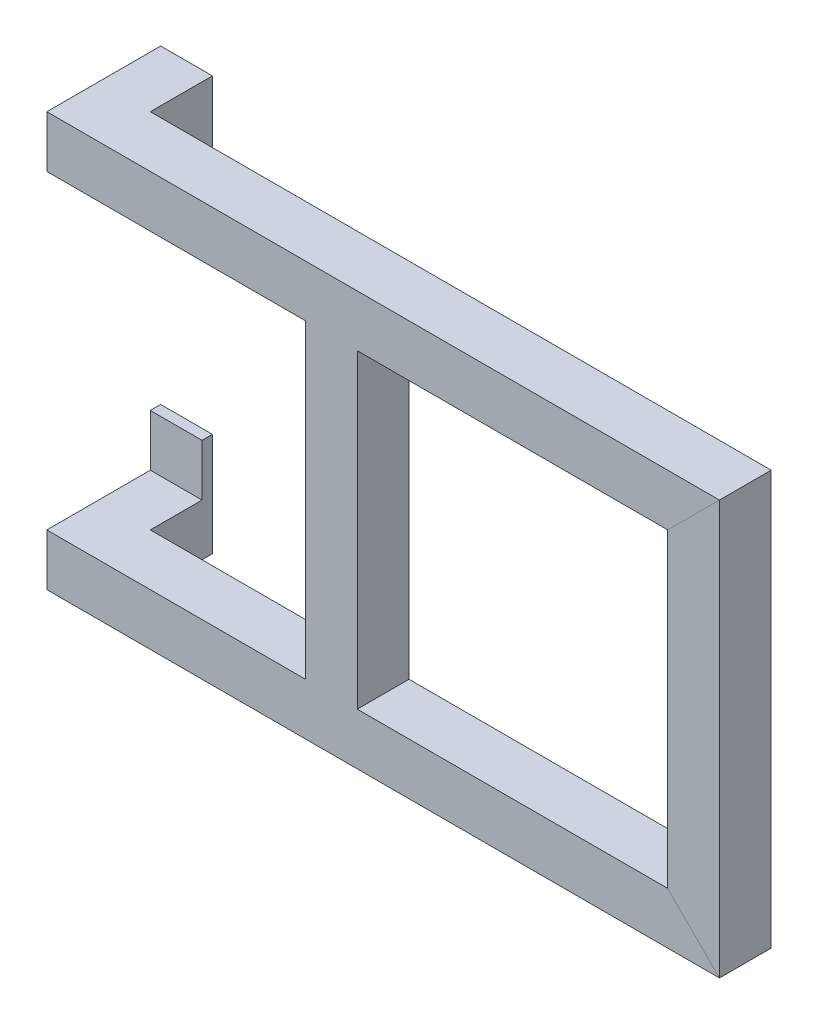
ISO-10303-21;
HEADER;
FILE_DESCRIPTION(('STEP AP214'),'2;1');
FILE_NAME('part.step','',(''),(''),'','','');
FILE_SCHEMA(('AUTOMOTIVE_DESIGN { 1 0 10303 214 1 1 1 1 }'));
ENDSEC;
DATA;
#1=APPLICATION_CONTEXT('core data for automotive mechanical design processes');
#2=APPLICATION_PROTOCOL_DEFINITION('international standard','automotive_design',2000,#1);
#3=PRODUCT_CONTEXT('',#1,'mechanical');
#4=PRODUCT('Part','Part','',(#3));
#5=PRODUCT_RELATED_PRODUCT_CATEGORY('part','',(#4));
#6=PRODUCT_DEFINITION_FORMATION('','',#4);
#7=PRODUCT_DEFINITION_CONTEXT('part definition',#1,'design');
#8=PRODUCT_DEFINITION('design','',#6,#7);
#9=PRODUCT_DEFINITION_SHAPE('','',#8);
#10=(LENGTH_UNIT() NAMED_UNIT(*) SI_UNIT(.MILLI.,.METRE.));
#11=(NAMED_UNIT(*) PLANE_ANGLE_UNIT() SI_UNIT($,.RADIAN.));
#12=(NAMED_UNIT(*) SI_UNIT($,.STERADIAN.) SOLID_ANGLE_UNIT());
#13=UNCERTAINTY_MEASURE_WITH_UNIT(LENGTH_MEASURE(1.E-05),#10,'distance_accuracy_value','');
#14=(GEOMETRIC_REPRESENTATION_CONTEXT(3) GLOBAL_UNCERTAINTY_ASSIGNED_CONTEXT((#13)) GLOBAL_UNIT_ASSIGNED_CONTEXT((#10,
#11,#12)) REPRESENTATION_CONTEXT('',''));
#15=CARTESIAN_POINT('',(0.,0.,0.));
#16=DIRECTION('',(0.,0.,1.));
#17=DIRECTION('',(1.,0.,0.));
#18=AXIS2_PLACEMENT_3D('',#15,#16,#17);
#19=CARTESIAN_POINT('',(325.,-150.,0.));
#20=DIRECTION('',(0.,1.,0.));
#21=DIRECTION('',(0.,0.,1.));
#22=AXIS2_PLACEMENT_3D('',#19,#20,#21);
#23=PLANE('',#22);
#24=DIRECTION('',(0.,0.,1.));
#25=VECTOR('',#24,1.);
#26=CARTESIAN_POINT('',(-275.,-150.,-110.));
#27=LINE('',#26,#25);
#28=CARTESIAN_POINT('',(-275.,-150.,-100.));
#29=VERTEX_POINT('',#28);
#30=CARTESIAN_POINT('',(-275.,-150.,-50.));
#31=VERTEX_POINT('',#30);
#32=EDGE_CURVE('E57',#29,#31,#27,.T.);
#33=ORIENTED_EDGE('',*,*,#32,.F.);
#34=DIRECTION('',(-1.,0.,0.));
#35=VECTOR('',#34,1.);
#36=CARTESIAN_POINT('',(325.,-150.,-100.));
#37=LINE('',#36,#35);
#38=CARTESIAN_POINT('',(-325.,-150.,-100.));
#39=VERTEX_POINT('',#38);
#40=EDGE_CURVE('E52',#29,#39,#37,.T.);
#41=ORIENTED_EDGE('',*,*,#40,.T.);
#42=DIRECTION('',(0.,0.,-1.));
#43=VECTOR('',#42,1.);
#44=CARTESIAN_POINT('',(-325.,-150.,0.));
#45=LINE('',#44,#43);
#46=CARTESIAN_POINT('',(-325.,-150.,0.));
#47=VERTEX_POINT('',#46);
#48=EDGE_CURVE('E179',#47,#39,#45,.T.);
#49=ORIENTED_EDGE('',*,*,#48,.F.);
#50=DIRECTION('',(-1.,0.,0.));
#51=VECTOR('',#50,1.);
#52=CARTESIAN_POINT('',(325.,-150.,0.));
#53=LINE('',#52,#51);
#54=CARTESIAN_POINT('',(-75.,-150.,0.));
#55=VERTEX_POINT('',#54);
#56=EDGE_CURVE('E325',#55,#47,#53,.T.);
#57=ORIENTED_EDGE('',*,*,#56,.F.);
#58=DIRECTION('',(0.,0.,1.));
#59=VECTOR('',#58,1.);
#60=CARTESIAN_POINT('',(-74.9999999999999,-150.,0.));
#61=LINE('',#60,#59);
#62=CARTESIAN_POINT('',(-74.9999999999999,-150.,-50.));
#63=VERTEX_POINT('',#62);
#64=EDGE_CURVE('E236',#63,#55,#61,.T.);
#65=ORIENTED_EDGE('',*,*,#64,.F.);
#66=DIRECTION('',(-1.,0.,0.));
#67=VECTOR('',#66,1.);
#68=CARTESIAN_POINT('',(325.,-150.,-50.));
#69=LINE('',#68,#67);
#70=EDGE_CURVE('E323',#63,#31,#69,.T.);
#71=ORIENTED_EDGE('',*,*,#70,.T.);
#72=EDGE_LOOP('',(#33,#41,#49,#57,#65,#71));
#73=FACE_BOUND('',#72,.T.);
#74=ADVANCED_FACE('F37',(#73),#23,.T.);
#75=CARTESIAN_POINT('',(-325.,150.,0.));
#76=DIRECTION('',(0.,-1.,0.));
#77=DIRECTION('',(0.,0.,-1.));
#78=AXIS2_PLACEMENT_3D('',#75,#76,#77);
#79=PLANE('',#78);
#80=DIRECTION('',(0.,0.,-1.));
#81=VECTOR('',#80,1.);
#82=CARTESIAN_POINT('',(-325.,150.,0.));
#83=LINE('',#82,#81);
#84=CARTESIAN_POINT('',(-325.,150.,0.));
#85=VERTEX_POINT('',#84);
#86=CARTESIAN_POINT('',(-325.,150.,-100.));
#87=VERTEX_POINT('',#86);
#88=EDGE_CURVE('E272',#85,#87,#83,.T.);
#89=ORIENTED_EDGE('',*,*,#88,.T.);
#90=DIRECTION('',(1.,0.,0.));
#91=VECTOR('',#90,1.);
#92=CARTESIAN_POINT('',(-325.,150.,-100.));
#93=LINE('',#92,#91);
#94=CARTESIAN_POINT('',(-275.,150.,-100.));
#95=VERTEX_POINT('',#94);
#96=EDGE_CURVE('E217',#87,#95,#93,.T.);
#97=ORIENTED_EDGE('',*,*,#96,.T.);
#98=DIRECTION('',(0.,0.,1.));
#99=VECTOR('',#98,1.);
#100=CARTESIAN_POINT('',(-275.,150.,-110.));
#101=LINE('',#100,#99);
#102=CARTESIAN_POINT('',(-275.,150.,-50.));
#103=VERTEX_POINT('',#102);
#104=EDGE_CURVE('E260',#95,#103,#101,.T.);
#105=ORIENTED_EDGE('',*,*,#104,.T.);
#106=DIRECTION('',(1.,0.,0.));
#107=VECTOR('',#106,1.);
#108=CARTESIAN_POINT('',(-325.,150.,-50.));
#109=LINE('',#108,#107);
#110=CARTESIAN_POINT('',(-75.,150.,-50.));
#111=VERTEX_POINT('',#110);
#112=EDGE_CURVE('E290',#103,#111,#109,.T.);
#113=ORIENTED_EDGE('',*,*,#112,.T.);
#114=DIRECTION('',(0.,0.,-1.));
#115=VECTOR('',#114,1.);
#116=CARTESIAN_POINT('',(-75.,150.,0.));
#117=LINE('',#116,#115);
#118=CARTESIAN_POINT('',(-75.,150.,0.));
#119=VERTEX_POINT('',#118);
#120=EDGE_CURVE('E234',#119,#111,#117,.T.);
#121=ORIENTED_EDGE('',*,*,#120,.F.);
#122=DIRECTION('',(1.,0.,0.));
#123=VECTOR('',#122,1.);
#124=CARTESIAN_POINT('',(-325.,150.,0.));
#125=LINE('',#124,#123);
#126=EDGE_CURVE('E278',#85,#119,#125,.T.);
#127=ORIENTED_EDGE('',*,*,#126,.F.);
#128=EDGE_LOOP('',(#89,#97,#105,#113,#121,#127));
#129=FACE_BOUND('',#128,.T.);
#130=ADVANCED_FACE('F342',(#129),#79,.T.);
#131=CARTESIAN_POINT('',(-325.,2.4980018054066E-13,0.));
#132=DIRECTION('',(-1.,0.,0.));
#133=DIRECTION('',(0.,0.,-1.));
#134=AXIS2_PLACEMENT_3D('',#131,#132,#133);
#135=PLANE('',#134);
#136=DIRECTION('',(0.,0.,1.));
#137=VECTOR('',#136,1.);
#138=CARTESIAN_POINT('',(-325.,-200.,0.));
#139=LINE('',#138,#137);
#140=CARTESIAN_POINT('',(-325.,-200.,-110.));
#141=VERTEX_POINT('',#140);
#142=CARTESIAN_POINT('',(-325.,-200.,0.));
#143=VERTEX_POINT('',#142);
#144=EDGE_CURVE('E263',#141,#143,#139,.T.);
#145=ORIENTED_EDGE('',*,*,#144,.T.);
#146=DIRECTION('',(0.,1.,0.));
#147=VECTOR('',#146,1.);
#148=CARTESIAN_POINT('',(-325.,-200.,0.));
#149=LINE('',#148,#147);
#150=EDGE_CURVE('E329',#143,#47,#149,.T.);
#151=ORIENTED_EDGE('',*,*,#150,.T.);
#152=ORIENTED_EDGE('',*,*,#48,.T.);
#153=DIRECTION('',(0.,1.,0.));
#154=VECTOR('',#153,1.);
#155=CARTESIAN_POINT('',(-325.,-200.,-100.));
#156=LINE('',#155,#154);
#157=CARTESIAN_POINT('',(-325.,-99.9999999999999,-100.));
#158=VERTEX_POINT('',#157);
#159=EDGE_CURVE('E173',#39,#158,#156,.T.);
#160=ORIENTED_EDGE('',*,*,#159,.T.);
#161=DIRECTION('',(0.,0.,-1.));
#162=VECTOR('',#161,1.);
#163=CARTESIAN_POINT('',(-325.,-99.9999999999999,-100.));
#164=LINE('',#163,#162);
#165=CARTESIAN_POINT('',(-325.,-99.9999999999999,-110.));
#166=VERTEX_POINT('',#165);
#167=EDGE_CURVE('E176',#158,#166,#164,.T.);
#168=ORIENTED_EDGE('',*,*,#167,.T.);
#169=DIRECTION('',(0.,-1.,0.));
#170=VECTOR('',#169,1.);
#171=CARTESIAN_POINT('',(-325.,-150.,-110.));
#172=LINE('',#171,#170);
#173=EDGE_CURVE('E239',#166,#141,#172,.T.);
#174=ORIENTED_EDGE('',*,*,#173,.T.);
#175=EDGE_LOOP('',(#145,#151,#152,#160,#168,#174));
#176=FACE_BOUND('',#175,.T.);
#177=ADVANCED_FACE('F39',(#176),#135,.T.);
#178=CARTESIAN_POINT('',(-325.,0.,0.));
#179=DIRECTION('',(1.,0.,0.));
#180=DIRECTION('',(0.,0.,-1.));
#181=AXIS2_PLACEMENT_3D('',#178,#179,#180);
#182=PLANE('',#181);
#183=DIRECTION('',(0.,-1.,0.));
#184=VECTOR('',#183,1.);
#185=CARTESIAN_POINT('',(-325.,200.,-110.));
#186=LINE('',#185,#184);
#187=CARTESIAN_POINT('',(-325.,200.,-110.));
#188=VERTEX_POINT('',#187);
#189=CARTESIAN_POINT('',(-325.,100.,-110.));
#190=VERTEX_POINT('',#189);
#191=EDGE_CURVE('E252',#188,#190,#186,.T.);
#192=ORIENTED_EDGE('',*,*,#191,.T.);
#193=DIRECTION('',(0.,0.,-1.));
#194=VECTOR('',#193,1.);
#195=CARTESIAN_POINT('',(-325.,100.,-100.));
#196=LINE('',#195,#194);
#197=CARTESIAN_POINT('',(-325.,100.,-100.));
#198=VERTEX_POINT('',#197);
#199=EDGE_CURVE('E214',#198,#190,#196,.T.);
#200=ORIENTED_EDGE('',*,*,#199,.F.);
#201=DIRECTION('',(0.,1.,0.));
#202=VECTOR('',#201,1.);
#203=CARTESIAN_POINT('',(-325.,200.,-100.));
#204=LINE('',#203,#202);
#205=EDGE_CURVE('E208',#198,#87,#204,.T.);
#206=ORIENTED_EDGE('',*,*,#205,.T.);
#207=ORIENTED_EDGE('',*,*,#88,.F.);
#208=DIRECTION('',(0.,-1.,0.));
#209=VECTOR('',#208,1.);
#210=CARTESIAN_POINT('',(-325.,200.,0.));
#211=LINE('',#210,#209);
#212=CARTESIAN_POINT('',(-325.,200.,0.));
#213=VERTEX_POINT('',#212);
#214=EDGE_CURVE('E45',#213,#85,#211,.T.);
#215=ORIENTED_EDGE('',*,*,#214,.F.);
#216=DIRECTION('',(0.,0.,1.));
#217=VECTOR('',#216,1.);
#218=CARTESIAN_POINT('',(-325.,200.,0.));
#219=LINE('',#218,#217);
#220=EDGE_CURVE('E270',#188,#213,#219,.T.);
#221=ORIENTED_EDGE('',*,*,#220,.F.);
#222=EDGE_LOOP('',(#192,#200,#206,#207,#215,#221));
#223=FACE_BOUND('',#222,.T.);
#224=ADVANCED_FACE('F355',(#223),#182,.F.);
#225=DIRECTION('',(0.,0.,-1.));
#226=VECTOR('',#225,1.);
#227=CARTESIAN_POINT('',(-24.9999999999999,-150.,0.));
#228=LINE('',#227,#226);
#229=CARTESIAN_POINT('',(-24.9999999999999,-150.,0.));
#230=VERTEX_POINT('',#229);
#231=CARTESIAN_POINT('',(-24.9999999999999,-150.,-50.));
#232=VERTEX_POINT('',#231);
#233=EDGE_CURVE('E232',#230,#232,#228,.T.);
#234=ORIENTED_EDGE('',*,*,#233,.F.);
#235=CARTESIAN_POINT('',(275.,-150.,0.));
#236=VERTEX_POINT('',#235);
#237=EDGE_CURVE('E331',#236,#230,#53,.T.);
#238=ORIENTED_EDGE('',*,*,#237,.F.);
#239=DIRECTION('',(0.,0.,1.));
#240=VECTOR('',#239,1.);
#241=CARTESIAN_POINT('',(275.,-150.,0.));
#242=LINE('',#241,#240);
#243=CARTESIAN_POINT('',(275.,-150.,-50.));
#244=VERTEX_POINT('',#243);
#245=EDGE_CURVE('E309',#244,#236,#242,.T.);
#246=ORIENTED_EDGE('',*,*,#245,.F.);
#247=EDGE_CURVE('E326',#244,#232,#69,.T.);
#248=ORIENTED_EDGE('',*,*,#247,.T.);
#249=EDGE_LOOP('',(#234,#238,#246,#248));
#250=FACE_BOUND('',#249,.T.);
#251=ADVANCED_FACE('F344',(#250),#23,.T.);
#252=CARTESIAN_POINT('',(325.,-200.,0.));
#253=DIRECTION('',(0.,-1.,0.));
#254=DIRECTION('',(0.,0.,-1.));
#255=AXIS2_PLACEMENT_3D('',#252,#253,#254);
#256=PLANE('',#255);
#257=DIRECTION('',(0.,0.,1.));
#258=VECTOR('',#257,1.);
#259=CARTESIAN_POINT('',(-275.,-200.,-110.));
#260=LINE('',#259,#258);
#261=CARTESIAN_POINT('',(-275.,-200.,-110.));
#262=VERTEX_POINT('',#261);
#263=CARTESIAN_POINT('',(-275.,-200.,-50.));
#264=VERTEX_POINT('',#263);
#265=EDGE_CURVE('E246',#262,#264,#260,.T.);
#266=ORIENTED_EDGE('',*,*,#265,.T.);
#267=DIRECTION('',(-1.,0.,0.));
#268=VECTOR('',#267,1.);
#269=CARTESIAN_POINT('',(325.,-200.,-50.));
#270=LINE('',#269,#268);
#271=CARTESIAN_POINT('',(325.,-200.,-50.));
#272=VERTEX_POINT('',#271);
#273=EDGE_CURVE('E320',#272,#264,#270,.T.);
#274=ORIENTED_EDGE('',*,*,#273,.F.);
#275=DIRECTION('',(0.,0.,1.));
#276=VECTOR('',#275,1.);
#277=CARTESIAN_POINT('',(325.,-200.,0.));
#278=LINE('',#277,#276);
#279=CARTESIAN_POINT('',(325.,-200.,0.));
#280=VERTEX_POINT('',#279);
#281=EDGE_CURVE('E285',#272,#280,#278,.T.);
#282=ORIENTED_EDGE('',*,*,#281,.T.);
#283=DIRECTION('',(-1.,0.,0.));
#284=VECTOR('',#283,1.);
#285=CARTESIAN_POINT('',(325.,-200.,0.));
#286=LINE('',#285,#284);
#287=EDGE_CURVE('E310',#280,#143,#286,.T.);
#288=ORIENTED_EDGE('',*,*,#287,.T.);
#289=ORIENTED_EDGE('',*,*,#144,.F.);
#290=DIRECTION('',(1.,0.,0.));
#291=VECTOR('',#290,1.);
#292=CARTESIAN_POINT('',(-325.,-200.,-110.));
#293=LINE('',#292,#291);
#294=EDGE_CURVE('E241',#141,#262,#293,.T.);
#295=ORIENTED_EDGE('',*,*,#294,.T.);
#296=EDGE_LOOP('',(#266,#274,#282,#288,#289,#295));
#297=FACE_BOUND('',#296,.T.);
#298=ADVANCED_FACE('F354',(#297),#256,.T.);
#299=CARTESIAN_POINT('',(325.,200.,0.));
#300=DIRECTION('',(1.,0.,0.));
#301=DIRECTION('',(0.,1.,0.));
#302=AXIS2_PLACEMENT_3D('',#299,#300,#301);
#303=PLANE('',#302);
#304=ORIENTED_EDGE('',*,*,#281,.F.);
#305=DIRECTION('',(0.,-1.,0.));
#306=VECTOR('',#305,1.);
#307=CARTESIAN_POINT('',(325.,200.,-50.));
#308=LINE('',#307,#306);
#309=CARTESIAN_POINT('',(325.,200.,-50.));
#310=VERTEX_POINT('',#309);
#311=EDGE_CURVE('E301',#310,#272,#308,.T.);
#312=ORIENTED_EDGE('',*,*,#311,.F.);
#313=DIRECTION('',(0.,0.,1.));
#314=VECTOR('',#313,1.);
#315=CARTESIAN_POINT('',(325.,200.,0.));
#316=LINE('',#315,#314);
#317=CARTESIAN_POINT('',(325.,200.,0.));
#318=VERTEX_POINT('',#317);
#319=EDGE_CURVE('E265',#310,#318,#316,.T.);
#320=ORIENTED_EDGE('',*,*,#319,.T.);
#321=DIRECTION('',(0.,-1.,0.));
#322=VECTOR('',#321,1.);
#323=CARTESIAN_POINT('',(325.,200.,0.));
#324=LINE('',#323,#322);
#325=EDGE_CURVE('E296',#318,#280,#324,.T.);
#326=ORIENTED_EDGE('',*,*,#325,.T.);
#327=EDGE_LOOP('',(#304,#312,#320,#326));
#328=FACE_BOUND('',#327,.T.);
#329=ADVANCED_FACE('F361',(#328),#303,.T.);
#330=CARTESIAN_POINT('',(325.,200.,0.));
#331=DIRECTION('',(0.,0.,1.));
#332=DIRECTION('',(1.,0.,0.));
#333=AXIS2_PLACEMENT_3D('',#330,#331,#332);
#334=PLANE('',#333);
#335=DIRECTION('',(0.,-1.,0.));
#336=VECTOR('',#335,1.);
#337=CARTESIAN_POINT('',(275.,200.,0.));
#338=LINE('',#337,#336);
#339=CARTESIAN_POINT('',(275.,150.,0.));
#340=VERTEX_POINT('',#339);
#341=EDGE_CURVE('E299',#340,#236,#338,.T.);
#342=ORIENTED_EDGE('',*,*,#341,.T.);
#343=DIRECTION('',(0.707106781186548,-0.707106781186547,0.));
#344=VECTOR('',#343,1.);
#345=CARTESIAN_POINT('',(125.,1.11022302462516E-13,0.));
#346=LINE('',#345,#344);
#347=EDGE_CURVE('E300',#236,#280,#346,.T.);
#348=ORIENTED_EDGE('',*,*,#347,.T.);
#349=ORIENTED_EDGE('',*,*,#325,.F.);
#350=DIRECTION('',(0.707106781186547,0.707106781186548,0.));
#351=VECTOR('',#350,1.);
#352=CARTESIAN_POINT('',(1.66533453693773E-13,-125.,0.));
#353=LINE('',#352,#351);
#354=EDGE_CURVE('E269',#340,#318,#353,.T.);
#355=ORIENTED_EDGE('',*,*,#354,.F.);
#356=EDGE_LOOP('',(#342,#348,#349,#355));
#357=FACE_BOUND('',#356,.T.);
#358=ADVANCED_FACE('F391',(#357),#334,.T.);
#359=CARTESIAN_POINT('',(275.,200.,0.));
#360=DIRECTION('',(-1.,0.,0.));
#361=DIRECTION('',(0.,-1.,0.));
#362=AXIS2_PLACEMENT_3D('',#359,#360,#361);
#363=PLANE('',#362);
#364=DIRECTION('',(0.,-1.,0.));
#365=VECTOR('',#364,1.);
#366=CARTESIAN_POINT('',(275.,200.,-50.));
#367=LINE('',#366,#365);
#368=CARTESIAN_POINT('',(275.,150.,-50.));
#369=VERTEX_POINT('',#368);
#370=EDGE_CURVE('E304',#369,#244,#367,.T.);
#371=ORIENTED_EDGE('',*,*,#370,.T.);
#372=ORIENTED_EDGE('',*,*,#245,.T.);
#373=ORIENTED_EDGE('',*,*,#341,.F.);
#374=DIRECTION('',(0.,0.,1.));
#375=VECTOR('',#374,1.);
#376=CARTESIAN_POINT('',(275.,150.,0.));
#377=LINE('',#376,#375);
#378=EDGE_CURVE('E284',#369,#340,#377,.T.);
#379=ORIENTED_EDGE('',*,*,#378,.F.);
#380=EDGE_LOOP('',(#371,#372,#373,#379));
#381=FACE_BOUND('',#380,.T.);
#382=ADVANCED_FACE('F379',(#381),#363,.T.);
#383=CARTESIAN_POINT('',(325.,200.,-50.));
#384=DIRECTION('',(0.,0.,-1.));
#385=DIRECTION('',(-1.,0.,0.));
#386=AXIS2_PLACEMENT_3D('',#383,#384,#385);
#387=PLANE('',#386);
#388=ORIENTED_EDGE('',*,*,#311,.T.);
#389=DIRECTION('',(-0.707106781186548,0.707106781186547,0.));
#390=VECTOR('',#389,1.);
#391=CARTESIAN_POINT('',(125.,1.11022302462516E-13,-50.));
#392=LINE('',#391,#390);
#393=EDGE_CURVE('E306',#272,#244,#392,.T.);
#394=ORIENTED_EDGE('',*,*,#393,.T.);
#395=ORIENTED_EDGE('',*,*,#370,.F.);
#396=DIRECTION('',(-0.707106781186547,-0.707106781186548,0.));
#397=VECTOR('',#396,1.);
#398=CARTESIAN_POINT('',(1.66533453693773E-13,-125.,-50.));
#399=LINE('',#398,#397);
#400=EDGE_CURVE('E281',#310,#369,#399,.T.);
#401=ORIENTED_EDGE('',*,*,#400,.F.);
#402=EDGE_LOOP('',(#388,#394,#395,#401));
#403=FACE_BOUND('',#402,.T.);
#404=ADVANCED_FACE('F381',(#403),#387,.T.);
#405=CARTESIAN_POINT('',(-325.,200.,0.));
#406=DIRECTION('',(0.,1.,0.));
#407=DIRECTION('',(0.,0.,1.));
#408=AXIS2_PLACEMENT_3D('',#405,#406,#407);
#409=PLANE('',#408);
#410=ORIENTED_EDGE('',*,*,#220,.T.);
#411=DIRECTION('',(1.,0.,0.));
#412=VECTOR('',#411,1.);
#413=CARTESIAN_POINT('',(-325.,200.,0.));
#414=LINE('',#413,#412);
#415=EDGE_CURVE('E273',#213,#318,#414,.T.);
#416=ORIENTED_EDGE('',*,*,#415,.T.);
#417=ORIENTED_EDGE('',*,*,#319,.F.);
#418=DIRECTION('',(1.,0.,0.));
#419=VECTOR('',#418,1.);
#420=CARTESIAN_POINT('',(-325.,200.,-50.));
#421=LINE('',#420,#419);
#422=CARTESIAN_POINT('',(-275.,200.,-50.));
#423=VERTEX_POINT('',#422);
#424=EDGE_CURVE('E268',#423,#310,#421,.T.);
#425=ORIENTED_EDGE('',*,*,#424,.F.);
#426=DIRECTION('',(0.,0.,1.));
#427=VECTOR('',#426,1.);
#428=CARTESIAN_POINT('',(-275.,200.,-110.));
#429=LINE('',#428,#427);
#430=CARTESIAN_POINT('',(-275.,200.,-110.));
#431=VERTEX_POINT('',#430);
#432=EDGE_CURVE('E261',#431,#423,#429,.T.);
#433=ORIENTED_EDGE('',*,*,#432,.F.);
#434=DIRECTION('',(-1.,0.,0.));
#435=VECTOR('',#434,1.);
#436=CARTESIAN_POINT('',(-325.,200.,-110.));
#437=LINE('',#436,#435);
#438=EDGE_CURVE('E257',#431,#188,#437,.T.);
#439=ORIENTED_EDGE('',*,*,#438,.T.);
#440=EDGE_LOOP('',(#410,#416,#417,#425,#433,#439));
#441=FACE_BOUND('',#440,.T.);
#442=ADVANCED_FACE('F396',(#441),#409,.T.);
#443=CARTESIAN_POINT('',(-325.,200.,0.));
#444=DIRECTION('',(0.,0.,1.));
#445=DIRECTION('',(0.,-1.,0.));
#446=AXIS2_PLACEMENT_3D('',#443,#444,#445);
#447=PLANE('',#446);
#448=ORIENTED_EDGE('',*,*,#354,.T.);
#449=ORIENTED_EDGE('',*,*,#415,.F.);
#450=ORIENTED_EDGE('',*,*,#214,.T.);
#451=ORIENTED_EDGE('',*,*,#126,.T.);
#452=DIRECTION('',(0.,-1.,0.));
#453=VECTOR('',#452,1.);
#454=CARTESIAN_POINT('',(-75.,200.,0.));
#455=LINE('',#454,#453);
#456=EDGE_CURVE('E221',#119,#55,#455,.T.);
#457=ORIENTED_EDGE('',*,*,#456,.T.);
#458=ORIENTED_EDGE('',*,*,#56,.T.);
#459=ORIENTED_EDGE('',*,*,#150,.F.);
#460=ORIENTED_EDGE('',*,*,#287,.F.);
#461=ORIENTED_EDGE('',*,*,#347,.F.);
#462=ORIENTED_EDGE('',*,*,#237,.T.);
#463=DIRECTION('',(0.,1.,0.));
#464=VECTOR('',#463,1.);
#465=CARTESIAN_POINT('',(-25.,200.,0.));
#466=LINE('',#465,#464);
#467=CARTESIAN_POINT('',(-24.9999999999999,150.,0.));
#468=VERTEX_POINT('',#467);
#469=EDGE_CURVE('E225',#230,#468,#466,.T.);
#470=ORIENTED_EDGE('',*,*,#469,.T.);
#471=EDGE_CURVE('E293',#468,#340,#125,.T.);
#472=ORIENTED_EDGE('',*,*,#471,.T.);
#473=EDGE_LOOP('',(#448,#449,#450,#451,#457,#458,#459,#460,#461,#462,#470,#472));
#474=FACE_BOUND('',#473,.T.);
#475=ADVANCED_FACE('F338',(#474),#447,.T.);
#476=DIRECTION('',(0.,0.,1.));
#477=VECTOR('',#476,1.);
#478=CARTESIAN_POINT('',(-25.,150.,0.));
#479=LINE('',#478,#477);
#480=CARTESIAN_POINT('',(-25.,150.,-50.));
#481=VERTEX_POINT('',#480);
#482=EDGE_CURVE('E227',#481,#468,#479,.T.);
#483=ORIENTED_EDGE('',*,*,#482,.F.);
#484=EDGE_CURVE('E275',#481,#369,#109,.T.);
#485=ORIENTED_EDGE('',*,*,#484,.T.);
#486=ORIENTED_EDGE('',*,*,#378,.T.);
#487=ORIENTED_EDGE('',*,*,#471,.F.);
#488=EDGE_LOOP('',(#483,#485,#486,#487));
#489=FACE_BOUND('',#488,.T.);
#490=ADVANCED_FACE('F350',(#489),#79,.T.);
#491=CARTESIAN_POINT('',(-325.,200.,-50.));
#492=DIRECTION('',(0.,0.,-1.));
#493=DIRECTION('',(-1.,0.,0.));
#494=AXIS2_PLACEMENT_3D('',#491,#492,#493);
#495=PLANE('',#494);
#496=ORIENTED_EDGE('',*,*,#484,.F.);
#497=DIRECTION('',(0.,1.,0.));
#498=VECTOR('',#497,1.);
#499=CARTESIAN_POINT('',(-25.,200.,-50.));
#500=LINE('',#499,#498);
#501=EDGE_CURVE('E224',#232,#481,#500,.T.);
#502=ORIENTED_EDGE('',*,*,#501,.F.);
#503=ORIENTED_EDGE('',*,*,#247,.F.);
#504=ORIENTED_EDGE('',*,*,#393,.F.);
#505=ORIENTED_EDGE('',*,*,#273,.T.);
#506=DIRECTION('',(0.,-1.,0.));
#507=VECTOR('',#506,1.);
#508=CARTESIAN_POINT('',(-275.,-200.,-50.));
#509=LINE('',#508,#507);
#510=EDGE_CURVE('E248',#31,#264,#509,.T.);
#511=ORIENTED_EDGE('',*,*,#510,.F.);
#512=ORIENTED_EDGE('',*,*,#70,.F.);
#513=DIRECTION('',(0.,-1.,0.));
#514=VECTOR('',#513,1.);
#515=CARTESIAN_POINT('',(-75.,200.,-50.));
#516=LINE('',#515,#514);
#517=EDGE_CURVE('E222',#111,#63,#516,.T.);
#518=ORIENTED_EDGE('',*,*,#517,.F.);
#519=ORIENTED_EDGE('',*,*,#112,.F.);
#520=DIRECTION('',(0.,-1.,0.));
#521=VECTOR('',#520,1.);
#522=CARTESIAN_POINT('',(-275.,200.,-50.));
#523=LINE('',#522,#521);
#524=EDGE_CURVE('E11',#423,#103,#523,.T.);
#525=ORIENTED_EDGE('',*,*,#524,.F.);
#526=ORIENTED_EDGE('',*,*,#424,.T.);
#527=ORIENTED_EDGE('',*,*,#400,.T.);
#528=EDGE_LOOP('',(#496,#502,#503,#504,#505,#511,#512,#518,#519,#525,#526,#527));
#529=FACE_BOUND('',#528,.T.);
#530=ADVANCED_FACE('F351',(#529),#495,.T.);
#531=CARTESIAN_POINT('',(-275.,200.,-110.));
#532=DIRECTION('',(1.,0.,0.));
#533=DIRECTION('',(0.,0.,-1.));
#534=AXIS2_PLACEMENT_3D('',#531,#532,#533);
#535=PLANE('',#534);
#536=ORIENTED_EDGE('',*,*,#432,.T.);
#537=ORIENTED_EDGE('',*,*,#524,.T.);
#538=ORIENTED_EDGE('',*,*,#104,.F.);
#539=DIRECTION('',(0.,-1.,0.));
#540=VECTOR('',#539,1.);
#541=CARTESIAN_POINT('',(-275.,200.,-100.));
#542=LINE('',#541,#540);
#543=CARTESIAN_POINT('',(-275.,100.,-100.));
#544=VERTEX_POINT('',#543);
#545=EDGE_CURVE('E203',#95,#544,#542,.T.);
#546=ORIENTED_EDGE('',*,*,#545,.T.);
#547=DIRECTION('',(0.,0.,-1.));
#548=VECTOR('',#547,1.);
#549=CARTESIAN_POINT('',(-275.,100.,-100.));
#550=LINE('',#549,#548);
#551=CARTESIAN_POINT('',(-275.,100.,-110.));
#552=VERTEX_POINT('',#551);
#553=EDGE_CURVE('E211',#544,#552,#550,.T.);
#554=ORIENTED_EDGE('',*,*,#553,.T.);
#555=DIRECTION('',(0.,1.,0.));
#556=VECTOR('',#555,1.);
#557=CARTESIAN_POINT('',(-275.,200.,-110.));
#558=LINE('',#557,#556);
#559=EDGE_CURVE('E254',#552,#431,#558,.T.);
#560=ORIENTED_EDGE('',*,*,#559,.T.);
#561=EDGE_LOOP('',(#536,#537,#538,#546,#554,#560));
#562=FACE_BOUND('',#561,.T.);
#563=ADVANCED_FACE('F410',(#562),#535,.T.);
#564=CARTESIAN_POINT('',(0.,0.,-110.));
#565=DIRECTION('',(0.,0.,1.));
#566=DIRECTION('',(1.,0.,0.));
#567=AXIS2_PLACEMENT_3D('',#564,#565,#566);
#568=PLANE('',#567);
#569=ORIENTED_EDGE('',*,*,#191,.F.);
#570=ORIENTED_EDGE('',*,*,#438,.F.);
#571=ORIENTED_EDGE('',*,*,#559,.F.);
#572=DIRECTION('',(-1.,0.,0.));
#573=VECTOR('',#572,1.);
#574=CARTESIAN_POINT('',(-275.,100.,-110.));
#575=LINE('',#574,#573);
#576=EDGE_CURVE('E202',#552,#190,#575,.T.);
#577=ORIENTED_EDGE('',*,*,#576,.T.);
#578=EDGE_LOOP('',(#569,#570,#571,#577));
#579=FACE_BOUND('',#578,.T.);
#580=ADVANCED_FACE('F415',(#579),#568,.F.);
#581=CARTESIAN_POINT('',(-275.,-150.,-110.));
#582=DIRECTION('',(1.,0.,0.));
#583=DIRECTION('',(0.,0.,-1.));
#584=AXIS2_PLACEMENT_3D('',#581,#582,#583);
#585=PLANE('',#584);
#586=DIRECTION('',(0.,1.,0.));
#587=VECTOR('',#586,1.);
#588=CARTESIAN_POINT('',(-275.,-150.,-110.));
#589=LINE('',#588,#587);
#590=CARTESIAN_POINT('',(-275.,-99.9999999999999,-110.));
#591=VERTEX_POINT('',#590);
#592=EDGE_CURVE('E244',#262,#591,#589,.T.);
#593=ORIENTED_EDGE('',*,*,#592,.T.);
#594=DIRECTION('',(0.,0.,-1.));
#595=VECTOR('',#594,1.);
#596=CARTESIAN_POINT('',(-275.,-99.9999999999999,-100.));
#597=LINE('',#596,#595);
#598=CARTESIAN_POINT('',(-275.,-99.9999999999999,-100.));
#599=VERTEX_POINT('',#598);
#600=EDGE_CURVE('E190',#599,#591,#597,.T.);
#601=ORIENTED_EDGE('',*,*,#600,.F.);
#602=DIRECTION('',(0.,-1.,0.));
#603=VECTOR('',#602,1.);
#604=CARTESIAN_POINT('',(-275.,-200.,-100.));
#605=LINE('',#604,#603);
#606=EDGE_CURVE('E191',#599,#29,#605,.T.);
#607=ORIENTED_EDGE('',*,*,#606,.T.);
#608=ORIENTED_EDGE('',*,*,#32,.T.);
#609=ORIENTED_EDGE('',*,*,#510,.T.);
#610=ORIENTED_EDGE('',*,*,#265,.F.);
#611=EDGE_LOOP('',(#593,#601,#607,#608,#609,#610));
#612=FACE_BOUND('',#611,.T.);
#613=ADVANCED_FACE('F423',(#612),#585,.T.);
#614=CARTESIAN_POINT('',(0.,0.,-110.));
#615=DIRECTION('',(0.,0.,1.));
#616=DIRECTION('',(1.,0.,0.));
#617=AXIS2_PLACEMENT_3D('',#614,#615,#616);
#618=PLANE('',#617);
#619=ORIENTED_EDGE('',*,*,#173,.F.);
#620=DIRECTION('',(1.,0.,0.));
#621=VECTOR('',#620,1.);
#622=CARTESIAN_POINT('',(-325.,-99.9999999999999,-110.));
#623=LINE('',#622,#621);
#624=EDGE_CURVE('E183',#166,#591,#623,.T.);
#625=ORIENTED_EDGE('',*,*,#624,.T.);
#626=ORIENTED_EDGE('',*,*,#592,.F.);
#627=ORIENTED_EDGE('',*,*,#294,.F.);
#628=EDGE_LOOP('',(#619,#625,#626,#627));
#629=FACE_BOUND('',#628,.T.);
#630=ADVANCED_FACE('F426',(#629),#618,.F.);
#631=CARTESIAN_POINT('',(-75.,200.,-50.));
#632=DIRECTION('',(-1.,0.,0.));
#633=DIRECTION('',(0.,-1.,0.));
#634=AXIS2_PLACEMENT_3D('',#631,#632,#633);
#635=PLANE('',#634);
#636=ORIENTED_EDGE('',*,*,#517,.T.);
#637=ORIENTED_EDGE('',*,*,#64,.T.);
#638=ORIENTED_EDGE('',*,*,#456,.F.);
#639=ORIENTED_EDGE('',*,*,#120,.T.);
#640=EDGE_LOOP('',(#636,#637,#638,#639));
#641=FACE_BOUND('',#640,.T.);
#642=ADVANCED_FACE('F421',(#641),#635,.T.);
#643=CARTESIAN_POINT('',(-25.,200.,-50.));
#644=DIRECTION('',(1.,0.,0.));
#645=DIRECTION('',(0.,1.,0.));
#646=AXIS2_PLACEMENT_3D('',#643,#644,#645);
#647=PLANE('',#646);
#648=ORIENTED_EDGE('',*,*,#469,.F.);
#649=ORIENTED_EDGE('',*,*,#233,.T.);
#650=ORIENTED_EDGE('',*,*,#501,.T.);
#651=ORIENTED_EDGE('',*,*,#482,.T.);
#652=EDGE_LOOP('',(#648,#649,#650,#651));
#653=FACE_BOUND('',#652,.T.);
#654=ADVANCED_FACE('F368',(#653),#647,.T.);
#655=CARTESIAN_POINT('',(-275.,100.,-100.));
#656=DIRECTION('',(0.,-1.,0.));
#657=DIRECTION('',(0.,0.,-1.));
#658=AXIS2_PLACEMENT_3D('',#655,#656,#657);
#659=PLANE('',#658);
#660=ORIENTED_EDGE('',*,*,#576,.F.);
#661=ORIENTED_EDGE('',*,*,#553,.F.);
#662=DIRECTION('',(-1.,0.,0.));
#663=VECTOR('',#662,1.);
#664=CARTESIAN_POINT('',(-275.,100.,-100.));
#665=LINE('',#664,#663);
#666=EDGE_CURVE('E205',#544,#198,#665,.T.);
#667=ORIENTED_EDGE('',*,*,#666,.T.);
#668=ORIENTED_EDGE('',*,*,#199,.T.);
#669=EDGE_LOOP('',(#660,#661,#667,#668));
#670=FACE_BOUND('',#669,.T.);
#671=ADVANCED_FACE('F413',(#670),#659,.T.);
#672=CARTESIAN_POINT('',(0.,0.,-100.));
#673=DIRECTION('',(0.,0.,-1.));
#674=DIRECTION('',(-1.,0.,0.));
#675=AXIS2_PLACEMENT_3D('',#672,#673,#674);
#676=PLANE('',#675);
#677=ORIENTED_EDGE('',*,*,#96,.F.);
#678=ORIENTED_EDGE('',*,*,#205,.F.);
#679=ORIENTED_EDGE('',*,*,#666,.F.);
#680=ORIENTED_EDGE('',*,*,#545,.F.);
#681=EDGE_LOOP('',(#677,#678,#679,#680));
#682=FACE_BOUND('',#681,.T.);
#683=ADVANCED_FACE('F406',(#682),#676,.F.);
#684=CARTESIAN_POINT('',(-325.,-99.9999999999999,-100.));
#685=DIRECTION('',(0.,1.,0.));
#686=DIRECTION('',(0.,0.,1.));
#687=AXIS2_PLACEMENT_3D('',#684,#685,#686);
#688=PLANE('',#687);
#689=ORIENTED_EDGE('',*,*,#624,.F.);
#690=ORIENTED_EDGE('',*,*,#167,.F.);
#691=DIRECTION('',(1.,0.,0.));
#692=VECTOR('',#691,1.);
#693=CARTESIAN_POINT('',(-325.,-99.9999999999999,-100.));
#694=LINE('',#693,#692);
#695=EDGE_CURVE('E182',#158,#599,#694,.T.);
#696=ORIENTED_EDGE('',*,*,#695,.T.);
#697=ORIENTED_EDGE('',*,*,#600,.T.);
#698=EDGE_LOOP('',(#689,#690,#696,#697));
#699=FACE_BOUND('',#698,.T.);
#700=ADVANCED_FACE('F187',(#699),#688,.T.);
#701=CARTESIAN_POINT('',(0.,0.,-100.));
#702=DIRECTION('',(0.,0.,-1.));
#703=DIRECTION('',(-1.,0.,0.));
#704=AXIS2_PLACEMENT_3D('',#701,#702,#703);
#705=PLANE('',#704);
#706=ORIENTED_EDGE('',*,*,#40,.F.);
#707=ORIENTED_EDGE('',*,*,#606,.F.);
#708=ORIENTED_EDGE('',*,*,#695,.F.);
#709=ORIENTED_EDGE('',*,*,#159,.F.);
#710=EDGE_LOOP('',(#706,#707,#708,#709));
#711=FACE_BOUND('',#710,.T.);
#712=ADVANCED_FACE('F194',(#711),#705,.F.);
#713=CLOSED_SHELL('',(#74,#130,#177,#224,#251,#298,#329,#358,#382,#404,#442,#475,#490,#530,#563,
#580,#613,#630,#642,#654,#671,#683,#700,#712));
#714=MANIFOLD_SOLID_BREP('B2',#713);
#715=ADVANCED_BREP_SHAPE_REPRESENTATION('',(#18,#714),#14);
#716=SHAPE_DEFINITION_REPRESENTATION(#9,#715);
ENDSEC;
END-ISO-10303-21;
